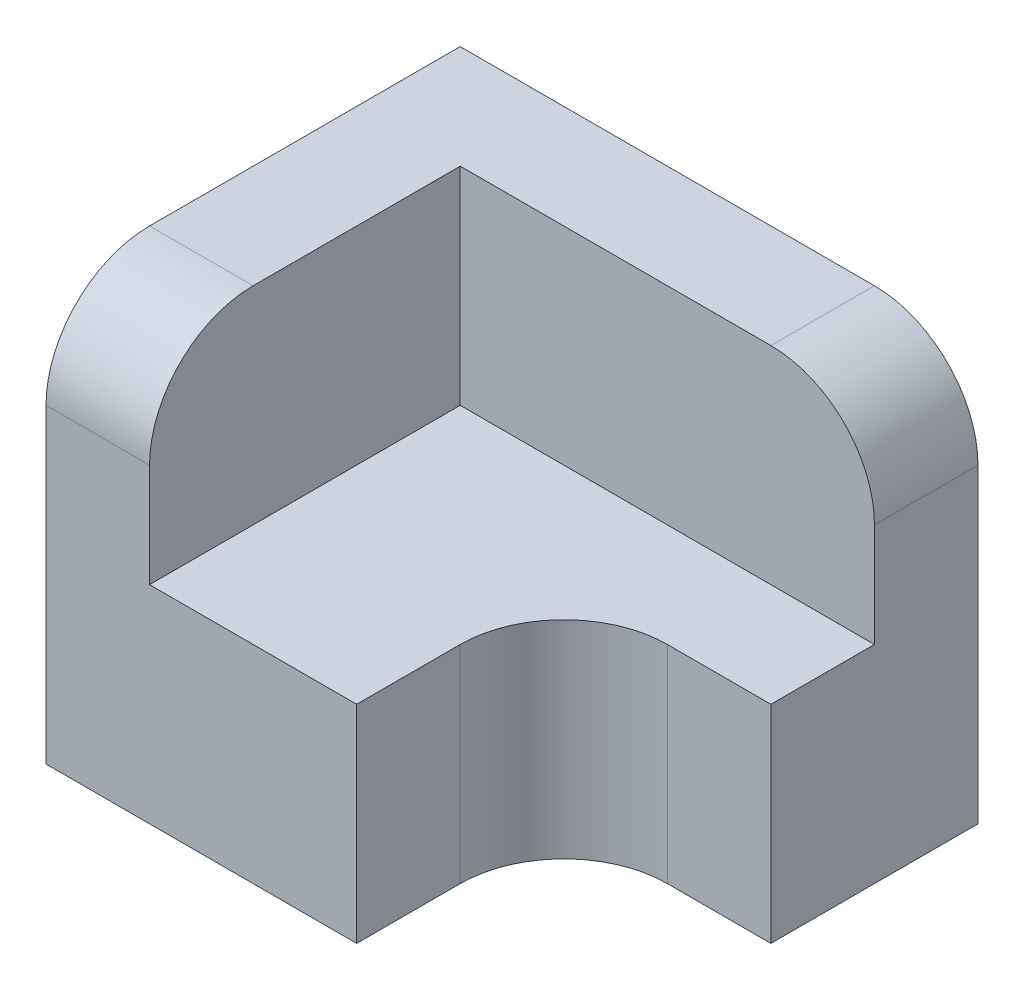
ISO-10303-21;
HEADER;
FILE_DESCRIPTION(('STEP AP214'),'2;1');
FILE_NAME('part.step','',(''),(''),'','','');
FILE_SCHEMA(('AUTOMOTIVE_DESIGN { 1 0 10303 214 1 1 1 1 }'));
ENDSEC;
DATA;
#1=APPLICATION_CONTEXT('core data for automotive mechanical design processes');
#2=APPLICATION_PROTOCOL_DEFINITION('international standard','automotive_design',2000,#1);
#3=PRODUCT_CONTEXT('',#1,'mechanical');
#4=PRODUCT('Part','Part','',(#3));
#5=PRODUCT_RELATED_PRODUCT_CATEGORY('part','',(#4));
#6=PRODUCT_DEFINITION_FORMATION('','',#4);
#7=PRODUCT_DEFINITION_CONTEXT('part definition',#1,'design');
#8=PRODUCT_DEFINITION('design','',#6,#7);
#9=PRODUCT_DEFINITION_SHAPE('','',#8);
#10=(LENGTH_UNIT() NAMED_UNIT(*) SI_UNIT(.MILLI.,.METRE.));
#11=(NAMED_UNIT(*) PLANE_ANGLE_UNIT() SI_UNIT($,.RADIAN.));
#12=(NAMED_UNIT(*) SI_UNIT($,.STERADIAN.) SOLID_ANGLE_UNIT());
#13=UNCERTAINTY_MEASURE_WITH_UNIT(LENGTH_MEASURE(1.E-05),#10,'distance_accuracy_value','');
#14=(GEOMETRIC_REPRESENTATION_CONTEXT(3) GLOBAL_UNCERTAINTY_ASSIGNED_CONTEXT((#13)) GLOBAL_UNIT_ASSIGNED_CONTEXT((#10,
#11,#12)) REPRESENTATION_CONTEXT('',''));
#15=CARTESIAN_POINT('',(0.,0.,0.));
#16=DIRECTION('',(0.,0.,1.));
#17=DIRECTION('',(1.,0.,0.));
#18=AXIS2_PLACEMENT_3D('',#15,#16,#17);
#19=CARTESIAN_POINT('',(-5.68106312292359,20.,0.0996677740863743));
#20=DIRECTION('',(0.,-1.,0.));
#21=DIRECTION('',(0.,0.,-1.));
#22=AXIS2_PLACEMENT_3D('',#19,#20,#21);
#23=PLANE('',#22);
#24=DIRECTION('',(0.,0.,-1.));
#25=VECTOR('',#24,1.);
#26=CARTESIAN_POINT('',(4.3189368770764,20.,-9.90033222591363));
#27=LINE('',#26,#25);
#28=CARTESIAN_POINT('',(4.3189368770764,20.,-9.90033222591363));
#29=VERTEX_POINT('',#28);
#30=CARTESIAN_POINT('',(4.3189368770764,20.,-19.9003322259136));
#31=VERTEX_POINT('',#30);
#32=EDGE_CURVE('E51',#29,#31,#27,.T.);
#33=ORIENTED_EDGE('',*,*,#32,.T.);
#34=DIRECTION('',(-1.,0.,0.));
#35=VECTOR('',#34,1.);
#36=CARTESIAN_POINT('',(4.3189368770764,20.,-19.9003322259136));
#37=LINE('',#36,#35);
#38=CARTESIAN_POINT('',(-35.6810631229236,20.,-19.9003322259136));
#39=VERTEX_POINT('',#38);
#40=EDGE_CURVE('E153',#31,#39,#37,.T.);
#41=ORIENTED_EDGE('',*,*,#40,.T.);
#42=DIRECTION('',(0.,0.,-1.));
#43=VECTOR('',#42,1.);
#44=CARTESIAN_POINT('',(-35.6810631229236,20.,10.0996677740864));
#45=LINE('',#44,#43);
#46=CARTESIAN_POINT('',(-35.6810631229236,20.,10.0996677740864));
#47=VERTEX_POINT('',#46);
#48=EDGE_CURVE('E160',#47,#39,#45,.T.);
#49=ORIENTED_EDGE('',*,*,#48,.F.);
#50=DIRECTION('',(1.,0.,0.));
#51=VECTOR('',#50,1.);
#52=CARTESIAN_POINT('',(-45.6810631229236,20.,10.0996677740864));
#53=LINE('',#52,#51);
#54=CARTESIAN_POINT('',(-15.6810631229236,20.,10.0996677740864));
#55=VERTEX_POINT('',#54);
#56=EDGE_CURVE('E181',#47,#55,#53,.T.);
#57=ORIENTED_EDGE('',*,*,#56,.T.);
#58=DIRECTION('',(0.,0.,-1.));
#59=VECTOR('',#58,1.);
#60=CARTESIAN_POINT('',(-15.6810631229236,20.,10.0996677740864));
#61=LINE('',#60,#59);
#62=CARTESIAN_POINT('',(-15.6810631229236,20.,0.0996677740864507));
#63=VERTEX_POINT('',#62);
#64=EDGE_CURVE('E183',#55,#63,#61,.T.);
#65=ORIENTED_EDGE('',*,*,#64,.T.);
#66=CARTESIAN_POINT('',(-5.68106312292359,20.,0.0996677740863743));
#67=DIRECTION('',(0.,-1.,0.));
#68=DIRECTION('',(0.,0.,-1.));
#69=AXIS2_PLACEMENT_3D('',#66,#67,#68);
#70=CIRCLE('',#69,10.);
#71=CARTESIAN_POINT('',(-5.68106312292359,20.,-9.90033222591363));
#72=VERTEX_POINT('',#71);
#73=EDGE_CURVE('E186',#63,#72,#70,.T.);
#74=ORIENTED_EDGE('',*,*,#73,.T.);
#75=DIRECTION('',(1.,0.,0.));
#76=VECTOR('',#75,1.);
#77=CARTESIAN_POINT('',(-5.68106312292352,20.,-9.90033222591363));
#78=LINE('',#77,#76);
#79=EDGE_CURVE('E188',#72,#29,#78,.T.);
#80=ORIENTED_EDGE('',*,*,#79,.T.);
#81=EDGE_LOOP('',(#33,#41,#49,#57,#65,#74,#80));
#82=FACE_BOUND('',#81,.T.);
#83=ADVANCED_FACE('F36',(#82),#23,.F.);
#84=CARTESIAN_POINT('',(4.3189368770764,20.,-29.9003322259136));
#85=DIRECTION('',(0.,0.,1.));
#86=DIRECTION('',(1.,0.,0.));
#87=AXIS2_PLACEMENT_3D('',#84,#85,#86);
#88=PLANE('',#87);
#89=DIRECTION('',(-1.,0.,0.));
#90=VECTOR('',#89,1.);
#91=CARTESIAN_POINT('',(4.3189368770764,0.,-29.9003322259136));
#92=LINE('',#91,#90);
#93=CARTESIAN_POINT('',(4.3189368770764,0.,-29.9003322259136));
#94=VERTEX_POINT('',#93);
#95=CARTESIAN_POINT('',(-45.6810631229236,0.,-29.9003322259136));
#96=VERTEX_POINT('',#95);
#97=EDGE_CURVE('E180',#94,#96,#92,.T.);
#98=ORIENTED_EDGE('',*,*,#97,.T.);
#99=DIRECTION('',(0.,-1.,0.));
#100=VECTOR('',#99,1.);
#101=CARTESIAN_POINT('',(-45.6810631229236,20.,-29.9003322259136));
#102=LINE('',#101,#100);
#103=CARTESIAN_POINT('',(-45.6810631229236,40.,-29.9003322259136));
#104=VERTEX_POINT('',#103);
#105=EDGE_CURVE('E11',#104,#96,#102,.T.);
#106=ORIENTED_EDGE('',*,*,#105,.F.);
#107=DIRECTION('',(-1.,0.,0.));
#108=VECTOR('',#107,1.);
#109=CARTESIAN_POINT('',(-35.6810631229236,40.,-29.9003322259136));
#110=LINE('',#109,#108);
#111=CARTESIAN_POINT('',(-5.68106312292367,40.,-29.9003322259136));
#112=VERTEX_POINT('',#111);
#113=EDGE_CURVE('E178',#112,#104,#110,.T.);
#114=ORIENTED_EDGE('',*,*,#113,.F.);
#115=CARTESIAN_POINT('',(-5.6810631229236,30.,-29.9003322259136));
#116=DIRECTION('',(0.,0.,1.));
#117=DIRECTION('',(1.,0.,0.));
#118=AXIS2_PLACEMENT_3D('',#115,#116,#117);
#119=CIRCLE('',#118,10.);
#120=CARTESIAN_POINT('',(4.3189368770764,29.9999999999999,-29.9003322259136));
#121=VERTEX_POINT('',#120);
#122=EDGE_CURVE('E136',#121,#112,#119,.T.);
#123=ORIENTED_EDGE('',*,*,#122,.F.);
#124=DIRECTION('',(0.,-1.,0.));
#125=VECTOR('',#124,1.);
#126=CARTESIAN_POINT('',(4.3189368770764,20.,-29.9003322259136));
#127=LINE('',#126,#125);
#128=EDGE_CURVE('E191',#121,#94,#127,.T.);
#129=ORIENTED_EDGE('',*,*,#128,.T.);
#130=EDGE_LOOP('',(#98,#106,#114,#123,#129));
#131=FACE_BOUND('',#130,.T.);
#132=ADVANCED_FACE('F38',(#131),#88,.F.);
#133=CARTESIAN_POINT('',(-45.6810631229236,20.,-29.9003322259136));
#134=DIRECTION('',(1.,0.,0.));
#135=DIRECTION('',(0.,0.,-1.));
#136=AXIS2_PLACEMENT_3D('',#133,#134,#135);
#137=PLANE('',#136);
#138=DIRECTION('',(0.,0.,1.));
#139=VECTOR('',#138,1.);
#140=CARTESIAN_POINT('',(-45.6810631229236,0.,-29.9003322259136));
#141=LINE('',#140,#139);
#142=CARTESIAN_POINT('',(-45.6810631229236,0.,10.0996677740864));
#143=VERTEX_POINT('',#142);
#144=EDGE_CURVE('E194',#96,#143,#141,.T.);
#145=ORIENTED_EDGE('',*,*,#144,.T.);
#146=DIRECTION('',(0.,-1.,0.));
#147=VECTOR('',#146,1.);
#148=CARTESIAN_POINT('',(-45.6810631229236,20.,10.0996677740864));
#149=LINE('',#148,#147);
#150=CARTESIAN_POINT('',(-45.6810631229236,29.9999999999999,10.0996677740864));
#151=VERTEX_POINT('',#150);
#152=EDGE_CURVE('E44',#151,#143,#149,.T.);
#153=ORIENTED_EDGE('',*,*,#152,.F.);
#154=CARTESIAN_POINT('',(-45.6810631229236,30.,0.099667774086379));
#155=DIRECTION('',(-1.,0.,0.));
#156=DIRECTION('',(0.,0.,1.));
#157=AXIS2_PLACEMENT_3D('',#154,#155,#156);
#158=CIRCLE('',#157,10.);
#159=CARTESIAN_POINT('',(-45.6810631229236,40.,0.0996677740863062));
#160=VERTEX_POINT('',#159);
#161=EDGE_CURVE('E162',#151,#160,#158,.T.);
#162=ORIENTED_EDGE('',*,*,#161,.T.);
#163=DIRECTION('',(0.,0.,1.));
#164=VECTOR('',#163,1.);
#165=CARTESIAN_POINT('',(-45.6810631229236,40.,-29.9003322259136));
#166=LINE('',#165,#164);
#167=EDGE_CURVE('E145',#104,#160,#166,.T.);
#168=ORIENTED_EDGE('',*,*,#167,.F.);
#169=ORIENTED_EDGE('',*,*,#105,.T.);
#170=EDGE_LOOP('',(#145,#153,#162,#168,#169));
#171=FACE_BOUND('',#170,.T.);
#172=ADVANCED_FACE('F248',(#171),#137,.F.);
#173=CARTESIAN_POINT('',(-45.6810631229236,20.,10.0996677740864));
#174=DIRECTION('',(0.,0.,-1.));
#175=DIRECTION('',(-1.,0.,0.));
#176=AXIS2_PLACEMENT_3D('',#173,#174,#175);
#177=PLANE('',#176);
#178=DIRECTION('',(1.,0.,0.));
#179=VECTOR('',#178,1.);
#180=CARTESIAN_POINT('',(-45.6810631229236,0.,10.0996677740864));
#181=LINE('',#180,#179);
#182=CARTESIAN_POINT('',(-15.6810631229236,0.,10.0996677740864));
#183=VERTEX_POINT('',#182);
#184=EDGE_CURVE('E196',#143,#183,#181,.T.);
#185=ORIENTED_EDGE('',*,*,#184,.T.);
#186=DIRECTION('',(0.,-1.,0.));
#187=VECTOR('',#186,1.);
#188=CARTESIAN_POINT('',(-15.6810631229236,20.,10.0996677740864));
#189=LINE('',#188,#187);
#190=EDGE_CURVE('E216',#55,#183,#189,.T.);
#191=ORIENTED_EDGE('',*,*,#190,.F.);
#192=ORIENTED_EDGE('',*,*,#56,.F.);
#193=DIRECTION('',(0.,-1.,0.));
#194=VECTOR('',#193,1.);
#195=CARTESIAN_POINT('',(-35.6810631229236,29.9999999999999,10.0996677740864));
#196=LINE('',#195,#194);
#197=CARTESIAN_POINT('',(-35.6810631229236,29.9999999999999,10.0996677740864));
#198=VERTEX_POINT('',#197);
#199=EDGE_CURVE('E167',#198,#47,#196,.T.);
#200=ORIENTED_EDGE('',*,*,#199,.F.);
#201=DIRECTION('',(-1.,0.,0.));
#202=VECTOR('',#201,1.);
#203=CARTESIAN_POINT('',(-35.6810631229236,29.9999999999999,10.0996677740864));
#204=LINE('',#203,#202);
#205=EDGE_CURVE('E170',#198,#151,#204,.T.);
#206=ORIENTED_EDGE('',*,*,#205,.T.);
#207=ORIENTED_EDGE('',*,*,#152,.T.);
#208=EDGE_LOOP('',(#185,#191,#192,#200,#206,#207));
#209=FACE_BOUND('',#208,.T.);
#210=ADVANCED_FACE('F221',(#209),#177,.F.);
#211=CARTESIAN_POINT('',(-15.6810631229236,20.,10.0996677740864));
#212=DIRECTION('',(-1.,0.,0.));
#213=DIRECTION('',(0.,0.,1.));
#214=AXIS2_PLACEMENT_3D('',#211,#212,#213);
#215=PLANE('',#214);
#216=DIRECTION('',(0.,0.,-1.));
#217=VECTOR('',#216,1.);
#218=CARTESIAN_POINT('',(-15.6810631229236,0.,10.0996677740864));
#219=LINE('',#218,#217);
#220=CARTESIAN_POINT('',(-15.6810631229236,0.,0.0996677740864507));
#221=VERTEX_POINT('',#220);
#222=EDGE_CURVE('E198',#183,#221,#219,.T.);
#223=ORIENTED_EDGE('',*,*,#222,.T.);
#224=DIRECTION('',(0.,-1.,0.));
#225=VECTOR('',#224,1.);
#226=CARTESIAN_POINT('',(-15.6810631229236,20.,0.0996677740864507));
#227=LINE('',#226,#225);
#228=EDGE_CURVE('E213',#63,#221,#227,.T.);
#229=ORIENTED_EDGE('',*,*,#228,.F.);
#230=ORIENTED_EDGE('',*,*,#64,.F.);
#231=ORIENTED_EDGE('',*,*,#190,.T.);
#232=EDGE_LOOP('',(#223,#229,#230,#231));
#233=FACE_BOUND('',#232,.T.);
#234=ADVANCED_FACE('F234',(#233),#215,.F.);
#235=CARTESIAN_POINT('',(-5.68106312292359,20.,0.0996677740863743));
#236=DIRECTION('',(0.,-1.,0.));
#237=DIRECTION('',(0.,0.,-1.));
#238=AXIS2_PLACEMENT_3D('',#235,#236,#237);
#239=CYLINDRICAL_SURFACE('',#238,10.);
#240=CARTESIAN_POINT('',(-5.68106312292359,0.,0.0996677740863743));
#241=DIRECTION('',(0.,-1.,0.));
#242=DIRECTION('',(0.,0.,-1.));
#243=AXIS2_PLACEMENT_3D('',#240,#241,#242);
#244=CIRCLE('',#243,10.);
#245=CARTESIAN_POINT('',(-5.68106312292359,0.,-9.90033222591363));
#246=VERTEX_POINT('',#245);
#247=EDGE_CURVE('E200',#221,#246,#244,.T.);
#248=ORIENTED_EDGE('',*,*,#247,.T.);
#249=DIRECTION('',(0.,-1.,0.));
#250=VECTOR('',#249,1.);
#251=CARTESIAN_POINT('',(-5.68106312292359,20.,-9.90033222591363));
#252=LINE('',#251,#250);
#253=EDGE_CURVE('E210',#72,#246,#252,.T.);
#254=ORIENTED_EDGE('',*,*,#253,.F.);
#255=ORIENTED_EDGE('',*,*,#73,.F.);
#256=ORIENTED_EDGE('',*,*,#228,.T.);
#257=EDGE_LOOP('',(#248,#254,#255,#256));
#258=FACE_BOUND('',#257,.T.);
#259=ADVANCED_FACE('F238',(#258),#239,.F.);
#260=CARTESIAN_POINT('',(-5.68106312292352,20.,-9.90033222591363));
#261=DIRECTION('',(0.,0.,-1.));
#262=DIRECTION('',(-1.,0.,0.));
#263=AXIS2_PLACEMENT_3D('',#260,#261,#262);
#264=PLANE('',#263);
#265=DIRECTION('',(1.,0.,0.));
#266=VECTOR('',#265,1.);
#267=CARTESIAN_POINT('',(-5.68106312292352,0.,-9.90033222591363));
#268=LINE('',#267,#266);
#269=CARTESIAN_POINT('',(4.3189368770764,0.,-9.90033222591363));
#270=VERTEX_POINT('',#269);
#271=EDGE_CURVE('E202',#246,#270,#268,.T.);
#272=ORIENTED_EDGE('',*,*,#271,.T.);
#273=DIRECTION('',(0.,-1.,0.));
#274=VECTOR('',#273,1.);
#275=CARTESIAN_POINT('',(4.3189368770764,20.,-9.90033222591363));
#276=LINE('',#275,#274);
#277=EDGE_CURVE('E207',#29,#270,#276,.T.);
#278=ORIENTED_EDGE('',*,*,#277,.F.);
#279=ORIENTED_EDGE('',*,*,#79,.F.);
#280=ORIENTED_EDGE('',*,*,#253,.T.);
#281=EDGE_LOOP('',(#272,#278,#279,#280));
#282=FACE_BOUND('',#281,.T.);
#283=ADVANCED_FACE('F254',(#282),#264,.F.);
#284=CARTESIAN_POINT('',(4.3189368770764,20.,-9.90033222591363));
#285=DIRECTION('',(-1.,0.,0.));
#286=DIRECTION('',(0.,0.,1.));
#287=AXIS2_PLACEMENT_3D('',#284,#285,#286);
#288=PLANE('',#287);
#289=DIRECTION('',(0.,0.,-1.));
#290=VECTOR('',#289,1.);
#291=CARTESIAN_POINT('',(4.3189368770764,0.,-9.90033222591363));
#292=LINE('',#291,#290);
#293=EDGE_CURVE('E184',#270,#94,#292,.T.);
#294=ORIENTED_EDGE('',*,*,#293,.T.);
#295=ORIENTED_EDGE('',*,*,#128,.F.);
#296=DIRECTION('',(0.,0.,-1.));
#297=VECTOR('',#296,1.);
#298=CARTESIAN_POINT('',(4.3189368770764,29.9999999999999,-19.9003322259136));
#299=LINE('',#298,#297);
#300=CARTESIAN_POINT('',(4.3189368770764,29.9999999999999,-19.9003322259136));
#301=VERTEX_POINT('',#300);
#302=EDGE_CURVE('E146',#301,#121,#299,.T.);
#303=ORIENTED_EDGE('',*,*,#302,.F.);
#304=DIRECTION('',(0.,-1.,0.));
#305=VECTOR('',#304,1.);
#306=CARTESIAN_POINT('',(4.3189368770764,29.9999999999999,-19.9003322259136));
#307=LINE('',#306,#305);
#308=EDGE_CURVE('E133',#301,#31,#307,.T.);
#309=ORIENTED_EDGE('',*,*,#308,.T.);
#310=ORIENTED_EDGE('',*,*,#32,.F.);
#311=ORIENTED_EDGE('',*,*,#277,.T.);
#312=EDGE_LOOP('',(#294,#295,#303,#309,#310,#311));
#313=FACE_BOUND('',#312,.T.);
#314=ADVANCED_FACE('F252',(#313),#288,.F.);
#315=CARTESIAN_POINT('',(-5.68106312292359,0.,0.0996677740863743));
#316=DIRECTION('',(0.,-1.,0.));
#317=DIRECTION('',(0.,0.,-1.));
#318=AXIS2_PLACEMENT_3D('',#315,#316,#317);
#319=PLANE('',#318);
#320=ORIENTED_EDGE('',*,*,#97,.F.);
#321=ORIENTED_EDGE('',*,*,#293,.F.);
#322=ORIENTED_EDGE('',*,*,#271,.F.);
#323=ORIENTED_EDGE('',*,*,#247,.F.);
#324=ORIENTED_EDGE('',*,*,#222,.F.);
#325=ORIENTED_EDGE('',*,*,#184,.F.);
#326=ORIENTED_EDGE('',*,*,#144,.F.);
#327=EDGE_LOOP('',(#320,#321,#322,#323,#324,#325,#326));
#328=FACE_BOUND('',#327,.T.);
#329=ADVANCED_FACE('F229',(#328),#319,.T.);
#330=CARTESIAN_POINT('',(-35.6810631229236,40.,-29.9003322259136));
#331=DIRECTION('',(0.,-1.,0.));
#332=DIRECTION('',(0.,0.,-1.));
#333=AXIS2_PLACEMENT_3D('',#330,#331,#332);
#334=PLANE('',#333);
#335=ORIENTED_EDGE('',*,*,#167,.T.);
#336=DIRECTION('',(-1.,0.,0.));
#337=VECTOR('',#336,1.);
#338=CARTESIAN_POINT('',(-35.6810631229236,40.,0.099667774086301));
#339=LINE('',#338,#337);
#340=CARTESIAN_POINT('',(-35.6810631229236,40.,0.099667774086301));
#341=VERTEX_POINT('',#340);
#342=EDGE_CURVE('E176',#341,#160,#339,.T.);
#343=ORIENTED_EDGE('',*,*,#342,.F.);
#344=DIRECTION('',(0.,0.,1.));
#345=VECTOR('',#344,1.);
#346=CARTESIAN_POINT('',(-35.6810631229236,40.,-29.9003322259136));
#347=LINE('',#346,#345);
#348=CARTESIAN_POINT('',(-35.6810631229236,40.,-19.9003322259136));
#349=VERTEX_POINT('',#348);
#350=EDGE_CURVE('E151',#349,#341,#347,.T.);
#351=ORIENTED_EDGE('',*,*,#350,.F.);
#352=DIRECTION('',(1.,0.,0.));
#353=VECTOR('',#352,1.);
#354=CARTESIAN_POINT('',(-35.6810631229236,40.,-19.9003322259136));
#355=LINE('',#354,#353);
#356=CARTESIAN_POINT('',(-5.68106312292367,40.,-19.9003322259136));
#357=VERTEX_POINT('',#356);
#358=EDGE_CURVE('E131',#349,#357,#355,.T.);
#359=ORIENTED_EDGE('',*,*,#358,.T.);
#360=DIRECTION('',(0.,0.,-1.));
#361=VECTOR('',#360,1.);
#362=CARTESIAN_POINT('',(-5.68106312292367,40.,-19.9003322259136));
#363=LINE('',#362,#361);
#364=EDGE_CURVE('E140',#357,#112,#363,.T.);
#365=ORIENTED_EDGE('',*,*,#364,.T.);
#366=ORIENTED_EDGE('',*,*,#113,.T.);
#367=EDGE_LOOP('',(#335,#343,#351,#359,#365,#366));
#368=FACE_BOUND('',#367,.T.);
#369=ADVANCED_FACE('F149',(#368),#334,.F.);
#370=CARTESIAN_POINT('',(-35.6810631229236,30.,0.0996677740863738));
#371=DIRECTION('',(-1.,0.,0.));
#372=DIRECTION('',(0.,0.,1.));
#373=AXIS2_PLACEMENT_3D('',#370,#371,#372);
#374=CYLINDRICAL_SURFACE('',#373,10.);
#375=ORIENTED_EDGE('',*,*,#161,.F.);
#376=ORIENTED_EDGE('',*,*,#205,.F.);
#377=CARTESIAN_POINT('',(-35.6810631229236,30.,0.0996677740863738));
#378=DIRECTION('',(-1.,0.,0.));
#379=DIRECTION('',(0.,0.,1.));
#380=AXIS2_PLACEMENT_3D('',#377,#378,#379);
#381=CIRCLE('',#380,10.);
#382=EDGE_CURVE('E164',#198,#341,#381,.T.);
#383=ORIENTED_EDGE('',*,*,#382,.T.);
#384=ORIENTED_EDGE('',*,*,#342,.T.);
#385=EDGE_LOOP('',(#375,#376,#383,#384));
#386=FACE_BOUND('',#385,.T.);
#387=ADVANCED_FACE('F246',(#386),#374,.T.);
#388=CARTESIAN_POINT('',(-35.6810631229236,30.,0.0996677740863738));
#389=DIRECTION('',(-1.,0.,0.));
#390=DIRECTION('',(0.,0.,1.));
#391=AXIS2_PLACEMENT_3D('',#388,#389,#390);
#392=PLANE('',#391);
#393=ORIENTED_EDGE('',*,*,#48,.T.);
#394=DIRECTION('',(0.,1.,0.));
#395=VECTOR('',#394,1.);
#396=CARTESIAN_POINT('',(-35.6810631229236,20.,-19.9003322259136));
#397=LINE('',#396,#395);
#398=EDGE_CURVE('E59',#39,#349,#397,.T.);
#399=ORIENTED_EDGE('',*,*,#398,.T.);
#400=ORIENTED_EDGE('',*,*,#350,.T.);
#401=ORIENTED_EDGE('',*,*,#382,.F.);
#402=ORIENTED_EDGE('',*,*,#199,.T.);
#403=EDGE_LOOP('',(#393,#399,#400,#401,#402));
#404=FACE_BOUND('',#403,.T.);
#405=ADVANCED_FACE('F244',(#404),#392,.F.);
#406=CARTESIAN_POINT('',(-5.6810631229236,30.,-19.9003322259136));
#407=DIRECTION('',(0.,0.,-1.));
#408=DIRECTION('',(-1.,0.,0.));
#409=AXIS2_PLACEMENT_3D('',#406,#407,#408);
#410=CYLINDRICAL_SURFACE('',#409,10.);
#411=ORIENTED_EDGE('',*,*,#122,.T.);
#412=ORIENTED_EDGE('',*,*,#364,.F.);
#413=CARTESIAN_POINT('',(-5.6810631229236,30.,-19.9003322259136));
#414=DIRECTION('',(0.,0.,1.));
#415=DIRECTION('',(1.,0.,0.));
#416=AXIS2_PLACEMENT_3D('',#413,#414,#415);
#417=CIRCLE('',#416,10.);
#418=EDGE_CURVE('E127',#301,#357,#417,.T.);
#419=ORIENTED_EDGE('',*,*,#418,.F.);
#420=ORIENTED_EDGE('',*,*,#302,.T.);
#421=EDGE_LOOP('',(#411,#412,#419,#420));
#422=FACE_BOUND('',#421,.T.);
#423=ADVANCED_FACE('F141',(#422),#410,.T.);
#424=CARTESIAN_POINT('',(-5.6810631229236,30.,-19.9003322259136));
#425=DIRECTION('',(0.,0.,1.));
#426=DIRECTION('',(1.,0.,0.));
#427=AXIS2_PLACEMENT_3D('',#424,#425,#426);
#428=PLANE('',#427);
#429=ORIENTED_EDGE('',*,*,#418,.T.);
#430=ORIENTED_EDGE('',*,*,#358,.F.);
#431=ORIENTED_EDGE('',*,*,#398,.F.);
#432=ORIENTED_EDGE('',*,*,#40,.F.);
#433=ORIENTED_EDGE('',*,*,#308,.F.);
#434=EDGE_LOOP('',(#429,#430,#431,#432,#433));
#435=FACE_BOUND('',#434,.T.);
#436=ADVANCED_FACE('F129',(#435),#428,.T.);
#437=CLOSED_SHELL('',(#83,#132,#172,#210,#234,#259,#283,#314,#329,#369,#387,#405,#423,#436));
#438=MANIFOLD_SOLID_BREP('B2',#437);
#439=ADVANCED_BREP_SHAPE_REPRESENTATION('',(#18,#438),#14);
#440=SHAPE_DEFINITION_REPRESENTATION(#9,#439);
ENDSEC;
END-ISO-10303-21;
